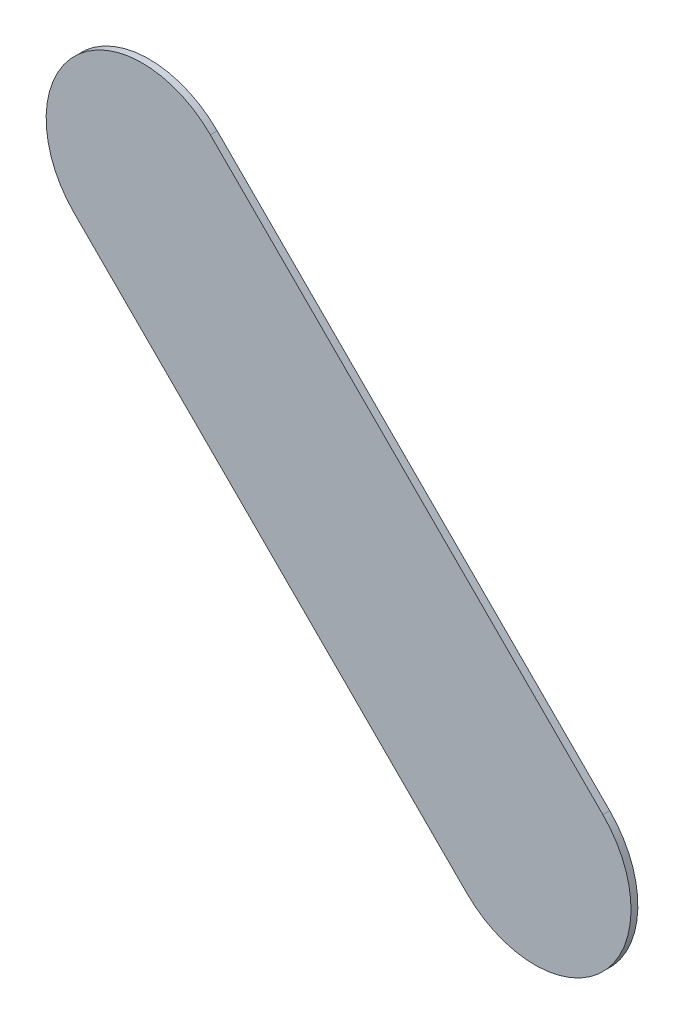
ISO-10303-21;
HEADER;
FILE_DESCRIPTION(('STEP AP214'),'2;1');
FILE_NAME('part.step','',(''),(''),'','','');
FILE_SCHEMA(('AUTOMOTIVE_DESIGN { 1 0 10303 214 1 1 1 1 }'));
ENDSEC;
DATA;
#1=APPLICATION_CONTEXT('core data for automotive mechanical design processes');
#2=APPLICATION_PROTOCOL_DEFINITION('international standard','automotive_design',2000,#1);
#3=PRODUCT_CONTEXT('',#1,'mechanical');
#4=PRODUCT('Part','Part','',(#3));
#5=PRODUCT_RELATED_PRODUCT_CATEGORY('part','',(#4));
#6=PRODUCT_DEFINITION_FORMATION('','',#4);
#7=PRODUCT_DEFINITION_CONTEXT('part definition',#1,'design');
#8=PRODUCT_DEFINITION('design','',#6,#7);
#9=PRODUCT_DEFINITION_SHAPE('','',#8);
#10=(LENGTH_UNIT() NAMED_UNIT(*) SI_UNIT(.MILLI.,.METRE.));
#11=(NAMED_UNIT(*) PLANE_ANGLE_UNIT() SI_UNIT($,.RADIAN.));
#12=(NAMED_UNIT(*) SI_UNIT($,.STERADIAN.) SOLID_ANGLE_UNIT());
#13=UNCERTAINTY_MEASURE_WITH_UNIT(LENGTH_MEASURE(1.E-05),#10,'distance_accuracy_value','');
#14=(GEOMETRIC_REPRESENTATION_CONTEXT(3) GLOBAL_UNCERTAINTY_ASSIGNED_CONTEXT((#13)) GLOBAL_UNIT_ASSIGNED_CONTEXT((#10,
#11,#12)) REPRESENTATION_CONTEXT('',''));
#15=CARTESIAN_POINT('',(0.,0.,0.));
#16=DIRECTION('',(0.,0.,1.));
#17=DIRECTION('',(1.,0.,0.));
#18=AXIS2_PLACEMENT_3D('',#15,#16,#17);
#19=CARTESIAN_POINT('',(97.00642524,114.68646862,0.));
#20=DIRECTION('',(0.707106781186545,0.70710678118655,0.));
#21=DIRECTION('',(0.70710678118655,-0.707106781186545,0.));
#22=AXIS2_PLACEMENT_3D('',#19,#20,#21);
#23=PLANE('',#22);
#24=DIRECTION('',(0.70710678118655,-0.707106781186545,0.));
#25=VECTOR('',#24,1.);
#26=CARTESIAN_POINT('',(97.00642524,114.68646862,0.03556));
#27=LINE('',#26,#25);
#28=CARTESIAN_POINT('',(97.00642524,114.68646862,0.03556));
#29=VERTEX_POINT('',#28);
#30=CARTESIAN_POINT('',(99.04644656,112.6464473,0.03556));
#31=VERTEX_POINT('',#30);
#32=EDGE_CURVE('E11',#29,#31,#27,.T.);
#33=ORIENTED_EDGE('',*,*,#32,.F.);
#34=DIRECTION('',(0.,0.,1.));
#35=VECTOR('',#34,1.);
#36=CARTESIAN_POINT('',(97.00642524,114.68646862,0.));
#37=LINE('',#36,#35);
#38=CARTESIAN_POINT('',(97.00642524,114.68646862,0.));
#39=VERTEX_POINT('',#38);
#40=EDGE_CURVE('E24',#39,#29,#37,.T.);
#41=ORIENTED_EDGE('',*,*,#40,.F.);
#42=DIRECTION('',(0.70710678118655,-0.707106781186545,0.));
#43=VECTOR('',#42,1.);
#44=CARTESIAN_POINT('',(97.00642524,114.68646862,0.));
#45=LINE('',#44,#43);
#46=CARTESIAN_POINT('',(99.04644656,112.6464473,0.));
#47=VERTEX_POINT('',#46);
#48=EDGE_CURVE('E75',#39,#47,#45,.T.);
#49=ORIENTED_EDGE('',*,*,#48,.T.);
#50=DIRECTION('',(0.,0.,1.));
#51=VECTOR('',#50,1.);
#52=CARTESIAN_POINT('',(99.04644656,112.6464473,0.));
#53=LINE('',#52,#51);
#54=EDGE_CURVE('E37',#47,#31,#53,.T.);
#55=ORIENTED_EDGE('',*,*,#54,.T.);
#56=EDGE_LOOP('',(#33,#41,#49,#55));
#57=FACE_BOUND('',#56,.T.);
#58=ADVANCED_FACE('F17',(#57),#23,.F.);
#59=CARTESIAN_POINT('',(99.39999932,113.00000006,0.));
#60=DIRECTION('',(0.,0.,-1.));
#61=DIRECTION('',(-0.707106781186548,-0.707106781186548,0.));
#62=AXIS2_PLACEMENT_3D('',#59,#60,#61);
#63=CYLINDRICAL_SURFACE('',#62,0.499999108206439);
#64=CARTESIAN_POINT('',(99.39999932,113.00000006,0.03556));
#65=DIRECTION('',(0.,0.,1.));
#66=DIRECTION('',(-0.707106781186548,-0.707106781186548,0.));
#67=AXIS2_PLACEMENT_3D('',#64,#65,#66);
#68=CIRCLE('',#67,0.499999108206439);
#69=CARTESIAN_POINT('',(99.75355208,113.35355282,0.03556));
#70=VERTEX_POINT('',#69);
#71=EDGE_CURVE('E83',#31,#70,#68,.T.);
#72=ORIENTED_EDGE('',*,*,#71,.F.);
#73=ORIENTED_EDGE('',*,*,#54,.F.);
#74=CARTESIAN_POINT('',(99.39999932,113.00000006,0.));
#75=DIRECTION('',(0.,0.,1.));
#76=DIRECTION('',(-0.707106781186548,-0.707106781186548,0.));
#77=AXIS2_PLACEMENT_3D('',#74,#75,#76);
#78=CIRCLE('',#77,0.499999108206439);
#79=CARTESIAN_POINT('',(99.75355208,113.35355282,0.));
#80=VERTEX_POINT('',#79);
#81=EDGE_CURVE('E81',#47,#80,#78,.T.);
#82=ORIENTED_EDGE('',*,*,#81,.T.);
#83=DIRECTION('',(0.,0.,1.));
#84=VECTOR('',#83,1.);
#85=CARTESIAN_POINT('',(99.75355208,113.35355282,0.));
#86=LINE('',#85,#84);
#87=EDGE_CURVE('E67',#80,#70,#86,.T.);
#88=ORIENTED_EDGE('',*,*,#87,.T.);
#89=EDGE_LOOP('',(#72,#73,#82,#88));
#90=FACE_BOUND('',#89,.T.);
#91=ADVANCED_FACE('F89',(#90),#63,.T.);
#92=CARTESIAN_POINT('',(99.75355208,113.35355282,0.));
#93=DIRECTION('',(-0.707106781186548,-0.707106781186548,0.));
#94=DIRECTION('',(-0.707106781186548,0.707106781186548,0.));
#95=AXIS2_PLACEMENT_3D('',#92,#93,#94);
#96=PLANE('',#95);
#97=DIRECTION('',(-0.707106781186548,0.707106781186548,0.));
#98=VECTOR('',#97,1.);
#99=CARTESIAN_POINT('',(99.75355208,113.35355282,0.03556));
#100=LINE('',#99,#98);
#101=CARTESIAN_POINT('',(97.71353076,115.39357414,0.03556));
#102=VERTEX_POINT('',#101);
#103=EDGE_CURVE('E71',#70,#102,#100,.T.);
#104=ORIENTED_EDGE('',*,*,#103,.F.);
#105=ORIENTED_EDGE('',*,*,#87,.F.);
#106=DIRECTION('',(-0.707106781186548,0.707106781186548,0.));
#107=VECTOR('',#106,1.);
#108=CARTESIAN_POINT('',(99.75355208,113.35355282,0.));
#109=LINE('',#108,#107);
#110=CARTESIAN_POINT('',(97.71353076,115.39357414,0.));
#111=VERTEX_POINT('',#110);
#112=EDGE_CURVE('E63',#80,#111,#109,.T.);
#113=ORIENTED_EDGE('',*,*,#112,.T.);
#114=DIRECTION('',(0.,0.,1.));
#115=VECTOR('',#114,1.);
#116=CARTESIAN_POINT('',(97.71353076,115.39357414,0.));
#117=LINE('',#116,#115);
#118=EDGE_CURVE('E53',#111,#102,#117,.T.);
#119=ORIENTED_EDGE('',*,*,#118,.T.);
#120=EDGE_LOOP('',(#104,#105,#113,#119));
#121=FACE_BOUND('',#120,.T.);
#122=ADVANCED_FACE('F66',(#121),#96,.F.);
#123=CARTESIAN_POINT('',(97.359978,115.04002138,0.));
#124=DIRECTION('',(0.,0.,-1.));
#125=DIRECTION('',(0.707106781186533,0.707106781186562,0.));
#126=AXIS2_PLACEMENT_3D('',#123,#124,#125);
#127=CYLINDRICAL_SURFACE('',#126,0.499999108206446);
#128=CARTESIAN_POINT('',(97.359978,115.04002138,0.03556));
#129=DIRECTION('',(0.,0.,1.));
#130=DIRECTION('',(0.707106781186533,0.707106781186562,0.));
#131=AXIS2_PLACEMENT_3D('',#128,#129,#130);
#132=CIRCLE('',#131,0.499999108206446);
#133=EDGE_CURVE('E59',#102,#29,#132,.T.);
#134=ORIENTED_EDGE('',*,*,#133,.F.);
#135=ORIENTED_EDGE('',*,*,#118,.F.);
#136=CARTESIAN_POINT('',(97.359978,115.04002138,0.));
#137=DIRECTION('',(0.,0.,1.));
#138=DIRECTION('',(0.707106781186533,0.707106781186562,0.));
#139=AXIS2_PLACEMENT_3D('',#136,#137,#138);
#140=CIRCLE('',#139,0.499999108206446);
#141=EDGE_CURVE('E57',#111,#39,#140,.T.);
#142=ORIENTED_EDGE('',*,*,#141,.T.);
#143=ORIENTED_EDGE('',*,*,#40,.T.);
#144=EDGE_LOOP('',(#134,#135,#142,#143));
#145=FACE_BOUND('',#144,.T.);
#146=ADVANCED_FACE('F55',(#145),#127,.T.);
#147=CARTESIAN_POINT('',(97.00642524,114.68646862,0.));
#148=DIRECTION('',(0.,0.,-1.));
#149=DIRECTION('',(-1.,0.,0.));
#150=AXIS2_PLACEMENT_3D('',#147,#148,#149);
#151=PLANE('',#150);
#152=ORIENTED_EDGE('',*,*,#141,.F.);
#153=ORIENTED_EDGE('',*,*,#112,.F.);
#154=ORIENTED_EDGE('',*,*,#81,.F.);
#155=ORIENTED_EDGE('',*,*,#48,.F.);
#156=EDGE_LOOP('',(#152,#153,#154,#155));
#157=FACE_BOUND('',#156,.T.);
#158=ADVANCED_FACE('F74',(#157),#151,.T.);
#159=CARTESIAN_POINT('',(97.00642524,114.68646862,0.03556));
#160=DIRECTION('',(0.,0.,-1.));
#161=DIRECTION('',(-1.,0.,0.));
#162=AXIS2_PLACEMENT_3D('',#159,#160,#161);
#163=PLANE('',#162);
#164=ORIENTED_EDGE('',*,*,#32,.T.);
#165=ORIENTED_EDGE('',*,*,#71,.T.);
#166=ORIENTED_EDGE('',*,*,#103,.T.);
#167=ORIENTED_EDGE('',*,*,#133,.T.);
#168=EDGE_LOOP('',(#164,#165,#166,#167));
#169=FACE_BOUND('',#168,.T.);
#170=ADVANCED_FACE('F91',(#169),#163,.F.);
#171=CLOSED_SHELL('',(#58,#91,#122,#146,#158,#170));
#172=MANIFOLD_SOLID_BREP('B1',#171);
#173=ADVANCED_BREP_SHAPE_REPRESENTATION('',(#18,#172),#14);
#174=SHAPE_DEFINITION_REPRESENTATION(#9,#173);
ENDSEC;
END-ISO-10303-21;
